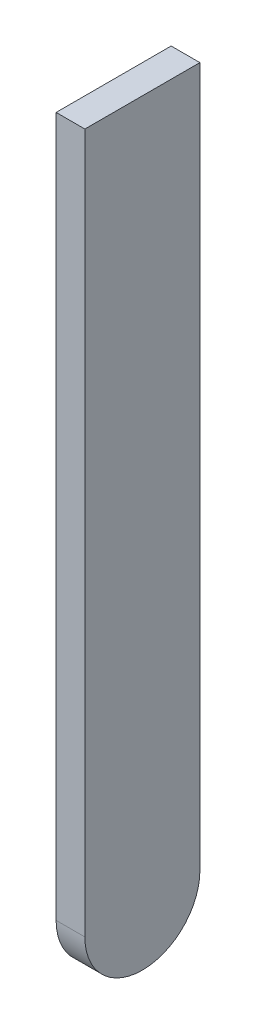
ISO-10303-21;
HEADER;
FILE_DESCRIPTION(('STEP AP214'),'2;1');
FILE_NAME('part.step','',(''),(''),'','','');
FILE_SCHEMA(('AUTOMOTIVE_DESIGN { 1 0 10303 214 1 1 1 1 }'));
ENDSEC;
DATA;
#1=APPLICATION_CONTEXT('core data for automotive mechanical design processes');
#2=APPLICATION_PROTOCOL_DEFINITION('international standard','automotive_design',2000,#1);
#3=PRODUCT_CONTEXT('',#1,'mechanical');
#4=PRODUCT('Part','Part','',(#3));
#5=PRODUCT_RELATED_PRODUCT_CATEGORY('part','',(#4));
#6=PRODUCT_DEFINITION_FORMATION('','',#4);
#7=PRODUCT_DEFINITION_CONTEXT('part definition',#1,'design');
#8=PRODUCT_DEFINITION('design','',#6,#7);
#9=PRODUCT_DEFINITION_SHAPE('','',#8);
#10=(LENGTH_UNIT() NAMED_UNIT(*) SI_UNIT(.MILLI.,.METRE.));
#11=(NAMED_UNIT(*) PLANE_ANGLE_UNIT() SI_UNIT($,.RADIAN.));
#12=(NAMED_UNIT(*) SI_UNIT($,.STERADIAN.) SOLID_ANGLE_UNIT());
#13=UNCERTAINTY_MEASURE_WITH_UNIT(LENGTH_MEASURE(1.E-05),#10,'distance_accuracy_value','');
#14=(GEOMETRIC_REPRESENTATION_CONTEXT(3) GLOBAL_UNCERTAINTY_ASSIGNED_CONTEXT((#13)) GLOBAL_UNIT_ASSIGNED_CONTEXT((#10,
#11,#12)) REPRESENTATION_CONTEXT('',''));
#15=CARTESIAN_POINT('',(0.,0.,0.));
#16=DIRECTION('',(0.,0.,1.));
#17=DIRECTION('',(1.,0.,0.));
#18=AXIS2_PLACEMENT_3D('',#15,#16,#17);
#19=CARTESIAN_POINT('',(-2.75,0.,-8.4));
#20=DIRECTION('',(-1.,0.,0.));
#21=DIRECTION('',(0.,0.,1.));
#22=AXIS2_PLACEMENT_3D('',#19,#20,#21);
#23=PLANE('',#22);
#24=DIRECTION('',(0.,0.,-1.));
#25=VECTOR('',#24,1.);
#26=CARTESIAN_POINT('',(-2.75,5.4,-8.4));
#27=LINE('',#26,#25);
#28=CARTESIAN_POINT('',(-2.75,5.4,-9.6));
#29=VERTEX_POINT('',#28);
#30=CARTESIAN_POINT('',(-2.75,5.4,-8.4));
#31=VERTEX_POINT('',#30);
#32=EDGE_CURVE('E74',#29,#31,#27,.F.);
#33=ORIENTED_EDGE('',*,*,#32,.T.);
#34=DIRECTION('',(0.,1.,0.));
#35=VECTOR('',#34,1.);
#36=CARTESIAN_POINT('',(-2.75,-0.500000000000001,-8.4));
#37=LINE('',#36,#35);
#38=CARTESIAN_POINT('',(-2.75,-1.9,-8.4));
#39=VERTEX_POINT('',#38);
#40=EDGE_CURVE('E66',#31,#39,#37,.F.);
#41=ORIENTED_EDGE('',*,*,#40,.T.);
#42=CARTESIAN_POINT('',(-2.75,-1.9,-9.));
#43=DIRECTION('',(-1.,0.,0.));
#44=DIRECTION('',(0.,0.,1.));
#45=AXIS2_PLACEMENT_3D('',#42,#43,#44);
#46=CIRCLE('',#45,0.6);
#47=CARTESIAN_POINT('',(-2.75,-1.9,-9.6));
#48=VERTEX_POINT('',#47);
#49=EDGE_CURVE('E19',#48,#39,#46,.T.);
#50=ORIENTED_EDGE('',*,*,#49,.F.);
#51=DIRECTION('',(0.,1.,0.));
#52=VECTOR('',#51,1.);
#53=CARTESIAN_POINT('',(-2.75,-0.500000000000001,-9.6));
#54=LINE('',#53,#52);
#55=EDGE_CURVE('E53',#29,#48,#54,.F.);
#56=ORIENTED_EDGE('',*,*,#55,.F.);
#57=EDGE_LOOP('',(#33,#41,#50,#56));
#58=FACE_BOUND('',#57,.T.);
#59=ADVANCED_FACE('F16',(#58),#23,.F.);
#60=CARTESIAN_POINT('',(-4.5,-1.9,-9.));
#61=DIRECTION('',(-1.,0.,0.));
#62=DIRECTION('',(0.,0.,1.));
#63=AXIS2_PLACEMENT_3D('',#60,#61,#62);
#64=CYLINDRICAL_SURFACE('',#63,0.6);
#65=CARTESIAN_POINT('',(-3.05,-1.9,-9.));
#66=DIRECTION('',(-1.,0.,0.));
#67=DIRECTION('',(0.,0.,1.));
#68=AXIS2_PLACEMENT_3D('',#65,#66,#67);
#69=CIRCLE('',#68,0.6);
#70=CARTESIAN_POINT('',(-3.05,-1.9,-8.4));
#71=VERTEX_POINT('',#70);
#72=CARTESIAN_POINT('',(-3.05,-1.9,-9.6));
#73=VERTEX_POINT('',#72);
#74=EDGE_CURVE('E72',#71,#73,#69,.F.);
#75=ORIENTED_EDGE('',*,*,#74,.T.);
#76=DIRECTION('',(-1.,0.,0.));
#77=VECTOR('',#76,1.);
#78=CARTESIAN_POINT('',(-3.55,-1.9,-9.6));
#79=LINE('',#78,#77);
#80=EDGE_CURVE('E58',#48,#73,#79,.T.);
#81=ORIENTED_EDGE('',*,*,#80,.F.);
#82=ORIENTED_EDGE('',*,*,#49,.T.);
#83=DIRECTION('',(-1.,0.,0.));
#84=VECTOR('',#83,1.);
#85=CARTESIAN_POINT('',(-3.55,-1.9,-8.4));
#86=LINE('',#85,#84);
#87=EDGE_CURVE('E80',#39,#71,#86,.T.);
#88=ORIENTED_EDGE('',*,*,#87,.T.);
#89=EDGE_LOOP('',(#75,#81,#82,#88));
#90=FACE_BOUND('',#89,.T.);
#91=ADVANCED_FACE('F71',(#90),#64,.T.);
#92=CARTESIAN_POINT('',(-3.55,-0.500000000000001,-9.6));
#93=DIRECTION('',(0.,0.,-1.));
#94=DIRECTION('',(-1.,0.,0.));
#95=AXIS2_PLACEMENT_3D('',#92,#93,#94);
#96=PLANE('',#95);
#97=ORIENTED_EDGE('',*,*,#80,.T.);
#98=DIRECTION('',(0.,1.,0.));
#99=VECTOR('',#98,1.);
#100=CARTESIAN_POINT('',(-3.05,0.,-9.6));
#101=LINE('',#100,#99);
#102=CARTESIAN_POINT('',(-3.05,5.4,-9.6));
#103=VERTEX_POINT('',#102);
#104=EDGE_CURVE('E87',#73,#103,#101,.T.);
#105=ORIENTED_EDGE('',*,*,#104,.T.);
#106=DIRECTION('',(1.,0.,0.));
#107=VECTOR('',#106,1.);
#108=CARTESIAN_POINT('',(-2.75,5.4,-9.6));
#109=LINE('',#108,#107);
#110=EDGE_CURVE('E60',#103,#29,#109,.T.);
#111=ORIENTED_EDGE('',*,*,#110,.T.);
#112=ORIENTED_EDGE('',*,*,#55,.T.);
#113=EDGE_LOOP('',(#97,#105,#111,#112));
#114=FACE_BOUND('',#113,.T.);
#115=ADVANCED_FACE('F55',(#114),#96,.T.);
#116=CARTESIAN_POINT('',(-2.75,5.4,-8.4));
#117=DIRECTION('',(0.,-1.,0.));
#118=DIRECTION('',(0.,0.,-1.));
#119=AXIS2_PLACEMENT_3D('',#116,#117,#118);
#120=PLANE('',#119);
#121=DIRECTION('',(-1.,0.,0.));
#122=VECTOR('',#121,1.);
#123=CARTESIAN_POINT('',(-3.55,5.4,-8.4));
#124=LINE('',#123,#122);
#125=CARTESIAN_POINT('',(-3.05,5.4,-8.4));
#126=VERTEX_POINT('',#125);
#127=EDGE_CURVE('E33',#126,#31,#124,.F.);
#128=ORIENTED_EDGE('',*,*,#127,.T.);
#129=ORIENTED_EDGE('',*,*,#32,.F.);
#130=ORIENTED_EDGE('',*,*,#110,.F.);
#131=DIRECTION('',(0.,0.,-1.));
#132=VECTOR('',#131,1.);
#133=CARTESIAN_POINT('',(-3.05,5.4,-8.4));
#134=LINE('',#133,#132);
#135=EDGE_CURVE('E25',#103,#126,#134,.F.);
#136=ORIENTED_EDGE('',*,*,#135,.T.);
#137=EDGE_LOOP('',(#128,#129,#130,#136));
#138=FACE_BOUND('',#137,.T.);
#139=ADVANCED_FACE('F101',(#138),#120,.F.);
#140=CARTESIAN_POINT('',(-3.55,-0.500000000000001,-8.4));
#141=DIRECTION('',(0.,0.,-1.));
#142=DIRECTION('',(-1.,0.,0.));
#143=AXIS2_PLACEMENT_3D('',#140,#141,#142);
#144=PLANE('',#143);
#145=ORIENTED_EDGE('',*,*,#40,.F.);
#146=ORIENTED_EDGE('',*,*,#127,.F.);
#147=DIRECTION('',(0.,1.,0.));
#148=VECTOR('',#147,1.);
#149=CARTESIAN_POINT('',(-3.05,0.,-8.4));
#150=LINE('',#149,#148);
#151=EDGE_CURVE('E11',#126,#71,#150,.F.);
#152=ORIENTED_EDGE('',*,*,#151,.T.);
#153=ORIENTED_EDGE('',*,*,#87,.F.);
#154=EDGE_LOOP('',(#145,#146,#152,#153));
#155=FACE_BOUND('',#154,.T.);
#156=ADVANCED_FACE('F104',(#155),#144,.F.);
#157=CARTESIAN_POINT('',(-3.05,0.,-8.4));
#158=DIRECTION('',(1.,0.,0.));
#159=DIRECTION('',(0.,0.,-1.));
#160=AXIS2_PLACEMENT_3D('',#157,#158,#159);
#161=PLANE('',#160);
#162=ORIENTED_EDGE('',*,*,#135,.F.);
#163=ORIENTED_EDGE('',*,*,#104,.F.);
#164=ORIENTED_EDGE('',*,*,#74,.F.);
#165=ORIENTED_EDGE('',*,*,#151,.F.);
#166=EDGE_LOOP('',(#162,#163,#164,#165));
#167=FACE_BOUND('',#166,.T.);
#168=ADVANCED_FACE('F103',(#167),#161,.F.);
#169=CLOSED_SHELL('',(#59,#91,#115,#139,#156,#168));
#170=MANIFOLD_SOLID_BREP('B1',#169);
#171=ADVANCED_BREP_SHAPE_REPRESENTATION('',(#18,#170),#14);
#172=SHAPE_DEFINITION_REPRESENTATION(#9,#171);
ENDSEC;
END-ISO-10303-21;
